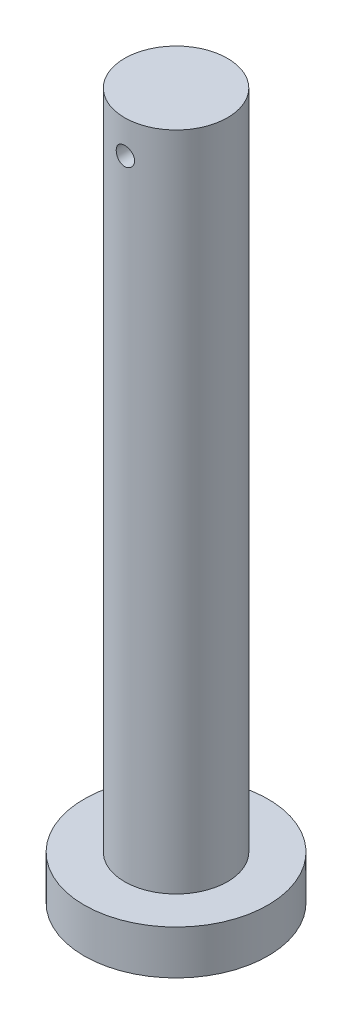
ISO-10303-21;
HEADER;
FILE_DESCRIPTION(('STEP AP214'),'2;1');
FILE_NAME('part.step','',(''),(''),'','','');
FILE_SCHEMA(('AUTOMOTIVE_DESIGN { 1 0 10303 214 1 1 1 1 }'));
ENDSEC;
DATA;
#1=APPLICATION_CONTEXT('core data for automotive mechanical design processes');
#2=APPLICATION_PROTOCOL_DEFINITION('international standard','automotive_design',2000,#1);
#3=PRODUCT_CONTEXT('',#1,'mechanical');
#4=PRODUCT('Part','Part','',(#3));
#5=PRODUCT_RELATED_PRODUCT_CATEGORY('part','',(#4));
#6=PRODUCT_DEFINITION_FORMATION('','',#4);
#7=PRODUCT_DEFINITION_CONTEXT('part definition',#1,'design');
#8=PRODUCT_DEFINITION('design','',#6,#7);
#9=PRODUCT_DEFINITION_SHAPE('','',#8);
#10=(LENGTH_UNIT() NAMED_UNIT(*) SI_UNIT(.MILLI.,.METRE.));
#11=(NAMED_UNIT(*) PLANE_ANGLE_UNIT() SI_UNIT($,.RADIAN.));
#12=(NAMED_UNIT(*) SI_UNIT($,.STERADIAN.) SOLID_ANGLE_UNIT());
#13=UNCERTAINTY_MEASURE_WITH_UNIT(LENGTH_MEASURE(1.E-05),#10,'distance_accuracy_value','');
#14=(GEOMETRIC_REPRESENTATION_CONTEXT(3) GLOBAL_UNCERTAINTY_ASSIGNED_CONTEXT((#13)) GLOBAL_UNIT_ASSIGNED_CONTEXT((#10,
#11,#12)) REPRESENTATION_CONTEXT('',''));
#15=CARTESIAN_POINT('',(0.,0.,0.));
#16=DIRECTION('',(0.,0.,1.));
#17=DIRECTION('',(1.,0.,0.));
#18=AXIS2_PLACEMENT_3D('',#15,#16,#17);
#19=CARTESIAN_POINT('',(0.,12.,0.));
#20=DIRECTION('',(0.,-1.,0.));
#21=DIRECTION('',(0.,0.,-1.));
#22=AXIS2_PLACEMENT_3D('',#19,#20,#21);
#23=CYLINDRICAL_SURFACE('',#22,25.);
#24=CARTESIAN_POINT('',(0.,12.,0.));
#25=DIRECTION('',(0.,1.,0.));
#26=DIRECTION('',(0.,0.,1.));
#27=AXIS2_PLACEMENT_3D('',#24,#25,#26);
#28=CIRCLE('',#27,25.);
#29=CARTESIAN_POINT('',(0.,12.,25.));
#30=VERTEX_POINT('',#29);
#31=EDGE_CURVE('E44',#30,#30,#28,.T.);
#32=ORIENTED_EDGE('',*,*,#31,.F.);
#33=EDGE_LOOP('',(#32));
#34=FACE_BOUND('',#33,.T.);
#35=CARTESIAN_POINT('',(0.,0.,0.));
#36=DIRECTION('',(0.,1.,0.));
#37=DIRECTION('',(0.,0.,1.));
#38=AXIS2_PLACEMENT_3D('',#35,#36,#37);
#39=CIRCLE('',#38,25.);
#40=CARTESIAN_POINT('',(0.,0.,25.));
#41=VERTEX_POINT('',#40);
#42=EDGE_CURVE('E49',#41,#41,#39,.T.);
#43=ORIENTED_EDGE('',*,*,#42,.T.);
#44=EDGE_LOOP('',(#43));
#45=FACE_BOUND('',#44,.T.);
#46=ADVANCED_FACE('F32',(#34,#45),#23,.T.);
#47=CARTESIAN_POINT('',(0.,12.,0.));
#48=DIRECTION('',(0.,1.,0.));
#49=DIRECTION('',(0.,0.,1.));
#50=AXIS2_PLACEMENT_3D('',#47,#48,#49);
#51=PLANE('',#50);
#52=CARTESIAN_POINT('',(0.,12.,0.));
#53=DIRECTION('',(0.,1.,0.));
#54=DIRECTION('',(0.,0.,1.));
#55=AXIS2_PLACEMENT_3D('',#52,#53,#54);
#56=CIRCLE('',#55,14.);
#57=CARTESIAN_POINT('',(0.,12.,14.));
#58=VERTEX_POINT('',#57);
#59=EDGE_CURVE('E10',#58,#58,#56,.T.);
#60=ORIENTED_EDGE('',*,*,#59,.F.);
#61=EDGE_LOOP('',(#60));
#62=FACE_BOUND('',#61,.T.);
#63=ORIENTED_EDGE('',*,*,#31,.T.);
#64=EDGE_LOOP('',(#63));
#65=FACE_BOUND('',#64,.T.);
#66=ADVANCED_FACE('F79',(#62,#65),#51,.T.);
#67=CARTESIAN_POINT('',(0.,0.,0.));
#68=DIRECTION('',(0.,1.,0.));
#69=DIRECTION('',(0.,0.,1.));
#70=AXIS2_PLACEMENT_3D('',#67,#68,#69);
#71=PLANE('',#70);
#72=ORIENTED_EDGE('',*,*,#42,.F.);
#73=EDGE_LOOP('',(#72));
#74=FACE_BOUND('',#73,.T.);
#75=ADVANCED_FACE('F75',(#74),#71,.F.);
#76=CARTESIAN_POINT('',(0.,192.,0.));
#77=DIRECTION('',(0.,-1.,0.));
#78=DIRECTION('',(0.,0.,-1.));
#79=AXIS2_PLACEMENT_3D('',#76,#77,#78);
#80=CYLINDRICAL_SURFACE('',#79,14.);
#81=CARTESIAN_POINT('',(0.,185.5,-14.));
#82=CARTESIAN_POINT('',(-0.139239584884693,185.499994557398,-13.9999975279519));
#83=CARTESIAN_POINT('',(-0.278551398798768,185.48832809755,-13.9979012185717));
#84=CARTESIAN_POINT('',(-0.55325746155145,185.441995833618,-13.9897405917584));
#85=CARTESIAN_POINT('',(-0.688648164109866,185.407309849162,-13.9836727927304));
#86=CARTESIAN_POINT('',(-0.951498716003345,185.316027766762,-13.9682487550673));
#87=CARTESIAN_POINT('',(-1.07896532023462,185.259450635632,-13.9588953637627));
#88=CARTESIAN_POINT('',(-1.32258294398845,185.126044311783,-13.9379246329878));
#89=CARTESIAN_POINT('',(-1.43873504418375,185.049217055801,-13.9263075100501));
#90=CARTESIAN_POINT('',(-1.65770744324835,184.876600786982,-13.9019523246795));
#91=CARTESIAN_POINT('',(-1.76038642030698,184.780633870129,-13.8892044205267));
#92=CARTESIAN_POINT('',(-1.94827611327336,184.572845250462,-13.8640984861177));
#93=CARTESIAN_POINT('',(-2.03348564380397,184.461022472631,-13.851740482366));
#94=CARTESIAN_POINT('',(-2.18459604528549,184.223709882887,-13.828718102426));
#95=CARTESIAN_POINT('',(-2.25035491937042,184.098128313076,-13.8180664295287));
#96=CARTESIAN_POINT('',(-2.35978878168926,183.837478841335,-13.799800524336));
#97=CARTESIAN_POINT('',(-2.40346549014525,183.702411679276,-13.7921860554493));
#98=CARTESIAN_POINT('',(-2.46704527057167,183.428131178585,-13.7809553111512));
#99=CARTESIAN_POINT('',(-2.48719373563912,183.288976444858,-13.7772977959189));
#100=CARTESIAN_POINT('',(-2.50390640595674,183.009217077993,-13.7742705702387));
#101=CARTESIAN_POINT('',(-2.5004725277955,182.868612563608,-13.7749005113397));
#102=CARTESIAN_POINT('',(-2.47031736473549,182.591711102563,-13.78033942777));
#103=CARTESIAN_POINT('',(-2.44387361595033,182.455382809746,-13.7850985960022));
#104=CARTESIAN_POINT('',(-2.36888575386109,182.189129363501,-13.7981816164895));
#105=CARTESIAN_POINT('',(-2.32034078106029,182.059204459315,-13.8065056073765));
#106=CARTESIAN_POINT('',(-2.2022526779638,181.808625521131,-13.8258332062344));
#107=CARTESIAN_POINT('',(-2.13259607876041,181.688026118391,-13.836851230427));
#108=CARTESIAN_POINT('',(-1.974342402063,181.460122497785,-13.8603157063341));
#109=CARTESIAN_POINT('',(-1.88574357580469,181.352819508901,-13.8727622898853));
#110=CARTESIAN_POINT('',(-1.69061708906588,181.152949782213,-13.8978993100277));
#111=CARTESIAN_POINT('',(-1.58385171151662,181.06061508202,-13.9105906924877));
#112=CARTESIAN_POINT('',(-1.35622200140277,180.895133867092,-13.934623736005));
#113=CARTESIAN_POINT('',(-1.23535755129116,180.82198751235,-13.9459653858077));
#114=CARTESIAN_POINT('',(-0.98272912541029,180.696930976304,-13.9660408385903));
#115=CARTESIAN_POINT('',(-0.850953766692502,180.645043317702,-13.9747718731006));
#116=CARTESIAN_POINT('',(-0.580367401035939,180.564203117808,-13.9886206199705));
#117=CARTESIAN_POINT('',(-0.441557072364818,180.535248369927,-13.9937386799627));
#118=CARTESIAN_POINT('',(-0.162838985381709,180.501415153955,-13.999737506353));
#119=CARTESIAN_POINT('',(-0.02297101705743,180.496218491452,-14.0006742692249));
#120=CARTESIAN_POINT('',(0.25563596226102,180.509197739763,-13.9983590537919));
#121=CARTESIAN_POINT('',(0.394375023096461,180.527372613028,-13.9951072614327));
#122=CARTESIAN_POINT('',(0.665788309880039,180.58631439849,-13.9848150834562));
#123=CARTESIAN_POINT('',(0.798498270193174,180.626921839218,-13.9778014506051));
#124=CARTESIAN_POINT('',(1.0552266666947,180.729404630185,-13.960768732277));
#125=CARTESIAN_POINT('',(1.1792445560083,180.791281317169,-13.9507494579045));
#126=CARTESIAN_POINT('',(1.4164370995142,180.935261222912,-13.9286773386827));
#127=CARTESIAN_POINT('',(1.52949072853057,181.01756079154,-13.9166051337771));
#128=CARTESIAN_POINT('',(1.74029662989027,181.199782651062,-13.8918196803142));
#129=CARTESIAN_POINT('',(1.8380476135904,181.299706424593,-13.8791063778887));
#130=CARTESIAN_POINT('',(2.01666949257316,181.515774969248,-13.8542878912599));
#131=CARTESIAN_POINT('',(2.09732417121668,181.632099700867,-13.8421918152179));
#132=CARTESIAN_POINT('',(2.23794827077399,181.876833689449,-13.8201546664427));
#133=CARTESIAN_POINT('',(2.29791841370413,182.005242524403,-13.8102135184939));
#134=CARTESIAN_POINT('',(2.39515706197427,182.269926174841,-13.7936819036385));
#135=CARTESIAN_POINT('',(2.43252842924636,182.406162210818,-13.7870762776017));
#136=CARTESIAN_POINT('',(2.48382895891452,182.683107295146,-13.7779274424092));
#137=CARTESIAN_POINT('',(2.49776049425864,182.823815889245,-13.7753838220348));
#138=CARTESIAN_POINT('',(2.50171229780527,183.103549208901,-13.7746664843416));
#139=CARTESIAN_POINT('',(2.49207328035334,183.242569077142,-13.7764304992774));
#140=CARTESIAN_POINT('',(2.44989946243099,183.516973818018,-13.7839923104721));
#141=CARTESIAN_POINT('',(2.4173647696137,183.652358707742,-13.7897900877646));
#142=CARTESIAN_POINT('',(2.33046113865349,183.915489876033,-13.8047410588042));
#143=CARTESIAN_POINT('',(2.27612576514715,184.043247551786,-13.8138890925692));
#144=CARTESIAN_POINT('',(2.14719934056735,184.287888439437,-13.8345140264404));
#145=CARTESIAN_POINT('',(2.07260704454504,184.404770982378,-13.8459910696717));
#146=CARTESIAN_POINT('',(1.90408567428783,184.62605704739,-13.8701759776461));
#147=CARTESIAN_POINT('',(1.80990741155503,184.730269231743,-13.8828984590281));
#148=CARTESIAN_POINT('',(1.60540999726032,184.921525805966,-13.9080282435319));
#149=CARTESIAN_POINT('',(1.49508713803928,185.008566241477,-13.920435473485));
#150=CARTESIAN_POINT('',(1.26037074660263,185.163657767789,-13.9436534678806));
#151=CARTESIAN_POINT('',(1.13587103767058,185.231550259392,-13.9544505684285));
#152=CARTESIAN_POINT('',(0.877084840190475,185.345349203293,-13.9730987112511));
#153=CARTESIAN_POINT('',(0.742807935956538,185.391276861498,-13.9809525934581));
#154=CARTESIAN_POINT('',(0.506731755491744,185.450230613396,-13.9911779735748));
#155=CARTESIAN_POINT('',(0.406334867671666,185.468863136937,-13.9944679971863));
#156=CARTESIAN_POINT('',(0.203971552038937,185.493749690404,-13.9988798925243));
#157=CARTESIAN_POINT('',(0.10200515810966,185.500003987181,-14.0000018109911));
#158=CARTESIAN_POINT('',(0.,185.5,-14.));
#159=B_SPLINE_CURVE_WITH_KNOTS('',3,(#81,#82,#83,#84,#85,#86,#87,#88,#89,#90,#91,#92,#93,#94,
#95,#96,#97,#98,#99,#100,#101,#102,#103,#104,#105,#106,#107,#108,#109,#110,#111,#112,#113,#114,
#115,#116,#117,#118,#119,#120,#121,#122,#123,#124,#125,#126,#127,#128,#129,#130,#131,#132,#133,
#134,#135,#136,#137,#138,#139,#140,#141,#142,#143,#144,#145,#146,#147,#148,#149,#150,#151,#152,
#153,#154,#155,#156,#157,#158),.UNSPECIFIED.,.T.,.F.,(4,2,2,2,2,2,2,2,2,2,2,2,2,2,2,2,2,2,2,2,2,
2,2,2,2,2,2,2,2,2,2,2,2,2,2,2,2,2,4),(0.,0.417345796741632,0.835057949374024,1.25240899749004,
1.66972014433902,2.09110796789027,2.51252437496282,2.93694536469343,3.36133328652203,
3.78125426758827,4.20114112116255,4.61603258426604,5.03094018350356,5.44811857395105,
5.8653354953455,6.28850377891475,6.71167559078142,7.13529458336167,7.55887281066884,
7.97676106621615,8.39463077078321,8.80956740145243,9.22453011509512,9.64364840488132,
10.062801969859,10.4869762077788,10.9111356379344,11.3333496148673,11.7555208460958,
12.1716257235315,12.5877286444974,13.0031933708605,13.4186836366131,13.8398246877353,
14.2610626074926,14.6856934454013,15.109913492521,15.4156623340469,15.7214045841282),.UNSPECIFIED.);
#160=CARTESIAN_POINT('',(0.,185.5,-14.));
#161=VERTEX_POINT('',#160);
#162=EDGE_CURVE('E35',#161,#161,#159,.T.);
#163=ORIENTED_EDGE('',*,*,#162,.T.);
#164=EDGE_LOOP('',(#163));
#165=FACE_BOUND('',#164,.T.);
#166=CARTESIAN_POINT('',(2.5,183.,13.7749773139559));
#167=CARTESIAN_POINT('',(2.49999454116292,182.860780366988,13.7749799387038));
#168=CARTESIAN_POINT('',(2.48833131153942,182.72148845813,13.7771107908789));
#169=CARTESIAN_POINT('',(2.44201304135071,182.446823734586,13.7853946199968));
#170=CARTESIAN_POINT('',(2.40733774573407,182.311454482243,13.7915511402328));
#171=CARTESIAN_POINT('',(2.31608691728922,182.048649339364,13.8071672988197));
#172=CARTESIAN_POINT('',(2.25953085486463,181.92120651227,13.8166239998033));
#173=CARTESIAN_POINT('',(2.12617418313794,181.677628912188,13.8377715156682));
#174=CARTESIAN_POINT('',(2.04937546105773,181.56149308643,13.8494621222548));
#175=CARTESIAN_POINT('',(1.87678833540929,181.342503072222,13.873907770039));
#176=CARTESIAN_POINT('',(1.78081562712207,181.239795182935,13.8866723857643));
#177=CARTESIAN_POINT('',(1.57300318552242,181.051849471074,13.9117430255489));
#178=CARTESIAN_POINT('',(1.46116245702622,180.966612745048,13.9240490207841));
#179=CARTESIAN_POINT('',(1.22383338523176,180.815473289733,13.9469179106052));
#180=CARTESIAN_POINT('',(1.09825637183169,180.749707728863,13.9574682193538));
#181=CARTESIAN_POINT('',(0.837616772802056,180.640260257314,13.9755301011882));
#182=CARTESIAN_POINT('',(0.702554895423188,180.596576699729,13.9830419008821));
#183=CARTESIAN_POINT('',(0.42829367364417,180.532983509955,13.9941127759412));
#184=CARTESIAN_POINT('',(0.289153116844097,180.512827582956,13.997712773247));
#185=CARTESIAN_POINT('',(0.00942173772768072,180.496095072754,14.0006952718093));
#186=CARTESIAN_POINT('',(-0.131168971263452,180.499516660767,14.0000781001693));
#187=CARTESIAN_POINT('',(-0.408122988432857,180.529651754197,13.9947279617152));
#188=CARTESIAN_POINT('',(-0.544516181052061,180.556100123599,13.9900418473477));
#189=CARTESIAN_POINT('',(-0.810897015102342,180.631119487911,13.9771327520065));
#190=CARTESIAN_POINT('',(-0.940884439369609,180.679691232261,13.9689096512162));
#191=CARTESIAN_POINT('',(-1.19154151829012,180.797835985916,13.9497715520927));
#192=CARTESIAN_POINT('',(-1.31215944836133,180.867516422082,13.9388428375475));
#193=CARTESIAN_POINT('',(-1.54009014093527,181.025821638939,13.9155046200703));
#194=CARTESIAN_POINT('',(-1.64740167052528,181.114448173023,13.9030949801311));
#195=CARTESIAN_POINT('',(-1.84724240926311,181.309595111988,13.8779680889456));
#196=CARTESIAN_POINT('',(-1.93954509991399,181.416347387838,13.8652489602259));
#197=CARTESIAN_POINT('',(-2.10496786240999,181.643939208173,13.8411025662894));
#198=CARTESIAN_POINT('',(-2.17808770266066,181.764778922711,13.8296753166704));
#199=CARTESIAN_POINT('',(-2.30312479829604,182.017399047897,13.8094045266784));
#200=CARTESIAN_POINT('',(-2.3550116418329,182.149194828246,13.8005646973667));
#201=CARTESIAN_POINT('',(-2.43584403060096,182.419825812411,13.7865283348087));
#202=CARTESIAN_POINT('',(-2.46479191631386,182.558660296524,13.7813314298779));
#203=CARTESIAN_POINT('',(-2.49859916205467,182.837392095441,13.7752421770154));
#204=CARTESIAN_POINT('',(-2.50378283673314,182.97724884695,13.7742918793935));
#205=CARTESIAN_POINT('',(-2.49078161816558,183.255830337016,13.776648684601));
#206=CARTESIAN_POINT('',(-2.47259776776007,183.394555125812,13.7799555974406));
#207=CARTESIAN_POINT('',(-2.41365525865842,183.665884582268,13.7904004323731));
#208=CARTESIAN_POINT('',(-2.37306442666378,183.798526902607,13.7975098617234));
#209=CARTESIAN_POINT('',(-2.27063733511702,184.055127312204,13.8147344144981));
#210=CARTESIAN_POINT('',(-2.20879963822381,184.179084813255,13.824849741264));
#211=CARTESIAN_POINT('',(-2.06487935022985,184.416232126468,13.847079502443));
#212=CARTESIAN_POINT('',(-1.98259057596105,184.529294908469,13.8592138527616));
#213=CARTESIAN_POINT('',(-1.80038422344424,184.740124255166,13.8840574336727));
#214=CARTESIAN_POINT('',(-1.70046521371052,184.837889576567,13.896766710884));
#215=CARTESIAN_POINT('',(-1.48439134339208,185.016548314716,13.9215130679047));
#216=CARTESIAN_POINT('',(-1.3680554862163,185.097224419615,13.9335402120035));
#217=CARTESIAN_POINT('',(-1.12329296566846,185.237886062422,13.9554035273845));
#218=CARTESIAN_POINT('',(-0.994866736508693,185.297872343022,13.9652397773074));
#219=CARTESIAN_POINT('',(-0.730189348324179,185.395120518557,13.9815700956849));
#220=CARTESIAN_POINT('',(-0.593979571421865,185.432492216578,13.9880802890981));
#221=CARTESIAN_POINT('',(-0.31709034328693,185.48380228348,13.9970934930076));
#222=CARTESIAN_POINT('',(-0.176411318075586,185.497742879091,13.9995968842815));
#223=CARTESIAN_POINT('',(0.103333169371384,185.501723426947,14.0003078168069));
#224=CARTESIAN_POINT('',(0.242393904292863,185.492092651136,13.9985745411226));
#225=CARTESIAN_POINT('',(0.516882556055421,185.449921033261,13.9911289095657));
#226=CARTESIAN_POINT('',(0.652310500982766,185.417380368374,13.9854165844658));
#227=CARTESIAN_POINT('',(0.915536497496647,185.330446063029,13.9706535216891));
#228=CARTESIAN_POINT('',(1.04334539246557,185.276084374272,13.9616076667541));
#229=CARTESIAN_POINT('',(1.28807790386464,185.14708930689,13.9411603934573));
#230=CARTESIAN_POINT('',(1.40500088290236,185.072454742247,13.9297588372901));
#231=CARTESIAN_POINT('',(1.6262914777391,184.903884011287,13.9056730650892));
#232=CARTESIAN_POINT('',(1.7304751643583,184.809708481173,13.892974041367));
#233=CARTESIAN_POINT('',(1.92167550896121,184.605228628036,13.8678219751628));
#234=CARTESIAN_POINT('',(2.00868813488379,184.49492052737,13.8553689910715));
#235=CARTESIAN_POINT('',(2.1637462241578,184.260218838816,13.8320070537405));
#236=CARTESIAN_POINT('',(2.23162894316816,184.13571634738,13.8211117157455));
#237=CARTESIAN_POINT('',(2.34540886935923,183.876924932344,13.8022610834653));
#238=CARTESIAN_POINT('',(2.39132736832844,183.742645632362,13.7943029436204));
#239=CARTESIAN_POINT('',(2.45025798781186,183.506593264787,13.7839341813702));
#240=CARTESIAN_POINT('',(2.46888019081668,183.406224134089,13.7805947327216));
#241=CARTESIAN_POINT('',(2.49375305438024,183.203916238032,13.7761153629215));
#242=CARTESIAN_POINT('',(2.50000399856396,183.101977508713,13.7749753913445));
#243=CARTESIAN_POINT('',(2.5,183.,13.7749773139559));
#244=B_SPLINE_CURVE_WITH_KNOTS('',3,(#166,#167,#168,#169,#170,#171,#172,#173,#174,#175,#176,
#177,#178,#179,#180,#181,#182,#183,#184,#185,#186,#187,#188,#189,#190,#191,#192,#193,#194,#195,
#196,#197,#198,#199,#200,#201,#202,#203,#204,#205,#206,#207,#208,#209,#210,#211,#212,#213,#214,
#215,#216,#217,#218,#219,#220,#221,#222,#223,#224,#225,#226,#227,#228,#229,#230,#231,#232,#233,
#234,#235,#236,#237,#238,#239,#240,#241,#242,#243),.UNSPECIFIED.,.T.,.F.,(4,2,2,2,2,2,2,2,2,2,2,
2,2,2,2,2,2,2,2,2,2,2,2,2,2,2,2,2,2,2,2,2,2,2,2,2,2,2,4),(0.,0.417285836009302,0.83493945195107,
1.25222227420762,1.66946620696472,2.09093251520216,2.51242526794801,2.93682027279779,
3.36118362098868,3.78106358503935,4.20091098159995,4.61598714610605,5.03107737256277,
5.44831662439174,5.86559450693789,6.2886798462335,6.7117702932007,7.13546462585336,
7.55911572303876,7.97696761802831,8.39480086586732,8.80954621973388,9.22431963646754,
9.64345757488935,10.0626295608599,10.4868484189542,10.9110520475065,11.3331791121111,
11.7552660584073,12.171490547398,12.5877118174954,13.0033258408441,13.4189641839515,
13.8400311188066,14.2611968100938,14.6858441972248,15.1100790990291,15.4157453666601,
15.7214046264678),.UNSPECIFIED.);
#245=CARTESIAN_POINT('',(2.5,183.,13.7749773139559));
#246=VERTEX_POINT('',#245);
#247=EDGE_CURVE('E55',#246,#246,#244,.T.);
#248=ORIENTED_EDGE('',*,*,#247,.T.);
#249=EDGE_LOOP('',(#248));
#250=FACE_BOUND('',#249,.T.);
#251=CARTESIAN_POINT('',(0.,192.,0.));
#252=DIRECTION('',(0.,1.,0.));
#253=DIRECTION('',(0.,0.,1.));
#254=AXIS2_PLACEMENT_3D('',#251,#252,#253);
#255=CIRCLE('',#254,14.);
#256=CARTESIAN_POINT('',(0.,192.,14.));
#257=VERTEX_POINT('',#256);
#258=EDGE_CURVE('E52',#257,#257,#255,.T.);
#259=ORIENTED_EDGE('',*,*,#258,.F.);
#260=EDGE_LOOP('',(#259));
#261=FACE_BOUND('',#260,.T.);
#262=ORIENTED_EDGE('',*,*,#59,.T.);
#263=EDGE_LOOP('',(#262));
#264=FACE_BOUND('',#263,.T.);
#265=ADVANCED_FACE('F60',(#165,#250,#261,#264),#80,.T.);
#266=CARTESIAN_POINT('',(0.,192.,0.));
#267=DIRECTION('',(0.,1.,0.));
#268=DIRECTION('',(0.,0.,1.));
#269=AXIS2_PLACEMENT_3D('',#266,#267,#268);
#270=PLANE('',#269);
#271=ORIENTED_EDGE('',*,*,#258,.T.);
#272=EDGE_LOOP('',(#271));
#273=FACE_BOUND('',#272,.T.);
#274=ADVANCED_FACE('F67',(#273),#270,.T.);
#275=CARTESIAN_POINT('',(0.,183.,-90.));
#276=DIRECTION('',(0.,0.,1.));
#277=DIRECTION('',(1.,0.,0.));
#278=AXIS2_PLACEMENT_3D('',#275,#276,#277);
#279=CYLINDRICAL_SURFACE('',#278,2.5);
#280=ORIENTED_EDGE('',*,*,#247,.F.);
#281=EDGE_LOOP('',(#280));
#282=FACE_BOUND('',#281,.T.);
#283=ORIENTED_EDGE('',*,*,#162,.F.);
#284=EDGE_LOOP('',(#283));
#285=FACE_BOUND('',#284,.T.);
#286=ADVANCED_FACE('F64',(#282,#285),#279,.F.);
#287=CLOSED_SHELL('',(#46,#66,#75,#265,#274,#286));
#288=MANIFOLD_SOLID_BREP('B2',#287);
#289=ADVANCED_BREP_SHAPE_REPRESENTATION('',(#18,#288),#14);
#290=SHAPE_DEFINITION_REPRESENTATION(#9,#289);
ENDSEC;
END-ISO-10303-21;
